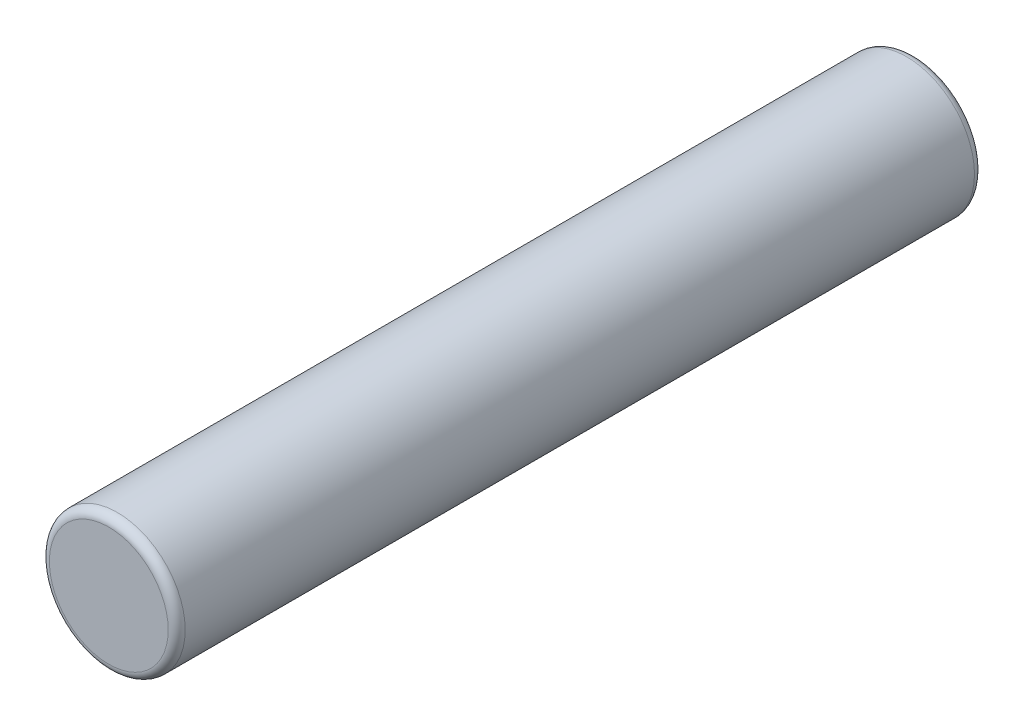
ISO-10303-21;
HEADER;
FILE_DESCRIPTION(('STEP AP214'),'2;1');
FILE_NAME('part.step','',(''),(''),'','','');
FILE_SCHEMA(('AUTOMOTIVE_DESIGN { 1 0 10303 214 1 1 1 1 }'));
ENDSEC;
DATA;
#1=APPLICATION_CONTEXT('core data for automotive mechanical design processes');
#2=APPLICATION_PROTOCOL_DEFINITION('international standard','automotive_design',2000,#1);
#3=PRODUCT_CONTEXT('',#1,'mechanical');
#4=PRODUCT('Part','Part','',(#3));
#5=PRODUCT_RELATED_PRODUCT_CATEGORY('part','',(#4));
#6=PRODUCT_DEFINITION_FORMATION('','',#4);
#7=PRODUCT_DEFINITION_CONTEXT('part definition',#1,'design');
#8=PRODUCT_DEFINITION('design','',#6,#7);
#9=PRODUCT_DEFINITION_SHAPE('','',#8);
#10=(LENGTH_UNIT() NAMED_UNIT(*) SI_UNIT(.MILLI.,.METRE.));
#11=(NAMED_UNIT(*) PLANE_ANGLE_UNIT() SI_UNIT($,.RADIAN.));
#12=(NAMED_UNIT(*) SI_UNIT($,.STERADIAN.) SOLID_ANGLE_UNIT());
#13=UNCERTAINTY_MEASURE_WITH_UNIT(LENGTH_MEASURE(1.E-05),#10,'distance_accuracy_value','');
#14=(GEOMETRIC_REPRESENTATION_CONTEXT(3) GLOBAL_UNCERTAINTY_ASSIGNED_CONTEXT((#13)) GLOBAL_UNIT_ASSIGNED_CONTEXT((#10,
#11,#12)) REPRESENTATION_CONTEXT('',''));
#15=CARTESIAN_POINT('',(0.,0.,0.));
#16=DIRECTION('',(0.,0.,1.));
#17=DIRECTION('',(1.,0.,0.));
#18=AXIS2_PLACEMENT_3D('',#15,#16,#17);
#19=CARTESIAN_POINT('',(0.,0.,9.5));
#20=DIRECTION('',(0.,0.,-1.));
#21=DIRECTION('',(-1.,0.,0.));
#22=AXIS2_PLACEMENT_3D('',#19,#20,#21);
#23=CYLINDRICAL_SURFACE('',#22,0.8);
#24=CARTESIAN_POINT('',(0.,0.,9.4));
#25=DIRECTION('',(0.,0.,1.));
#26=DIRECTION('',(1.,0.,0.));
#27=AXIS2_PLACEMENT_3D('',#24,#25,#26);
#28=CIRCLE('',#27,0.8);
#29=CARTESIAN_POINT('',(0.8,0.,9.4));
#30=VERTEX_POINT('',#29);
#31=EDGE_CURVE('E38',#30,#30,#28,.F.);
#32=ORIENTED_EDGE('',*,*,#31,.T.);
#33=EDGE_LOOP('',(#32));
#34=FACE_BOUND('',#33,.T.);
#35=CARTESIAN_POINT('',(0.,0.,0.0999999999999994));
#36=DIRECTION('',(0.,0.,1.));
#37=DIRECTION('',(1.,0.,0.));
#38=AXIS2_PLACEMENT_3D('',#35,#36,#37);
#39=CIRCLE('',#38,0.8);
#40=CARTESIAN_POINT('',(0.8,0.,0.0999999999999994));
#41=VERTEX_POINT('',#40);
#42=EDGE_CURVE('E42',#41,#41,#39,.T.);
#43=ORIENTED_EDGE('',*,*,#42,.T.);
#44=EDGE_LOOP('',(#43));
#45=FACE_BOUND('',#44,.T.);
#46=ADVANCED_FACE('F31',(#34,#45),#23,.T.);
#47=CARTESIAN_POINT('',(0.,0.,9.5));
#48=DIRECTION('',(0.,0.,1.));
#49=DIRECTION('',(1.,0.,0.));
#50=AXIS2_PLACEMENT_3D('',#47,#48,#49);
#51=PLANE('',#50);
#52=CARTESIAN_POINT('',(0.,0.,9.5));
#53=DIRECTION('',(0.,0.,1.));
#54=DIRECTION('',(1.,0.,0.));
#55=AXIS2_PLACEMENT_3D('',#52,#53,#54);
#56=CIRCLE('',#55,0.7);
#57=CARTESIAN_POINT('',(0.7,0.,9.5));
#58=VERTEX_POINT('',#57);
#59=EDGE_CURVE('E46',#58,#58,#56,.T.);
#60=ORIENTED_EDGE('',*,*,#59,.T.);
#61=EDGE_LOOP('',(#60));
#62=FACE_BOUND('',#61,.T.);
#63=ADVANCED_FACE('F52',(#62),#51,.T.);
#64=CARTESIAN_POINT('',(0.,0.,0.));
#65=DIRECTION('',(0.,0.,1.));
#66=DIRECTION('',(1.,0.,0.));
#67=AXIS2_PLACEMENT_3D('',#64,#65,#66);
#68=PLANE('',#67);
#69=CARTESIAN_POINT('',(0.,0.,0.));
#70=DIRECTION('',(0.,0.,1.));
#71=DIRECTION('',(1.,0.,0.));
#72=AXIS2_PLACEMENT_3D('',#69,#70,#71);
#73=CIRCLE('',#72,0.7);
#74=CARTESIAN_POINT('',(0.7,0.,0.));
#75=VERTEX_POINT('',#74);
#76=EDGE_CURVE('E10',#75,#75,#73,.F.);
#77=ORIENTED_EDGE('',*,*,#76,.T.);
#78=EDGE_LOOP('',(#77));
#79=FACE_BOUND('',#78,.T.);
#80=ADVANCED_FACE('F56',(#79),#68,.F.);
#81=CARTESIAN_POINT('',(0.,0.,9.4));
#82=DIRECTION('',(0.,0.,1.));
#83=DIRECTION('',(1.,0.,0.));
#84=AXIS2_PLACEMENT_3D('',#81,#82,#83);
#85=TOROIDAL_SURFACE('',#84,0.7,0.1);
#86=ORIENTED_EDGE('',*,*,#31,.F.);
#87=EDGE_LOOP('',(#86));
#88=FACE_BOUND('',#87,.T.);
#89=ORIENTED_EDGE('',*,*,#59,.F.);
#90=EDGE_LOOP('',(#89));
#91=FACE_BOUND('',#90,.T.);
#92=ADVANCED_FACE('F54',(#88,#91),#85,.T.);
#93=CARTESIAN_POINT('',(0.,0.,0.0999999999999994));
#94=DIRECTION('',(0.,0.,1.));
#95=DIRECTION('',(1.,0.,0.));
#96=AXIS2_PLACEMENT_3D('',#93,#94,#95);
#97=TOROIDAL_SURFACE('',#96,0.7,0.1);
#98=ORIENTED_EDGE('',*,*,#76,.F.);
#99=EDGE_LOOP('',(#98));
#100=FACE_BOUND('',#99,.T.);
#101=ORIENTED_EDGE('',*,*,#42,.F.);
#102=EDGE_LOOP('',(#101));
#103=FACE_BOUND('',#102,.T.);
#104=ADVANCED_FACE('F33',(#100,#103),#97,.T.);
#105=CLOSED_SHELL('',(#46,#63,#80,#92,#104));
#106=MANIFOLD_SOLID_BREP('B2',#105);
#107=ADVANCED_BREP_SHAPE_REPRESENTATION('',(#18,#106),#14);
#108=SHAPE_DEFINITION_REPRESENTATION(#9,#107);
ENDSEC;
END-ISO-10303-21;
